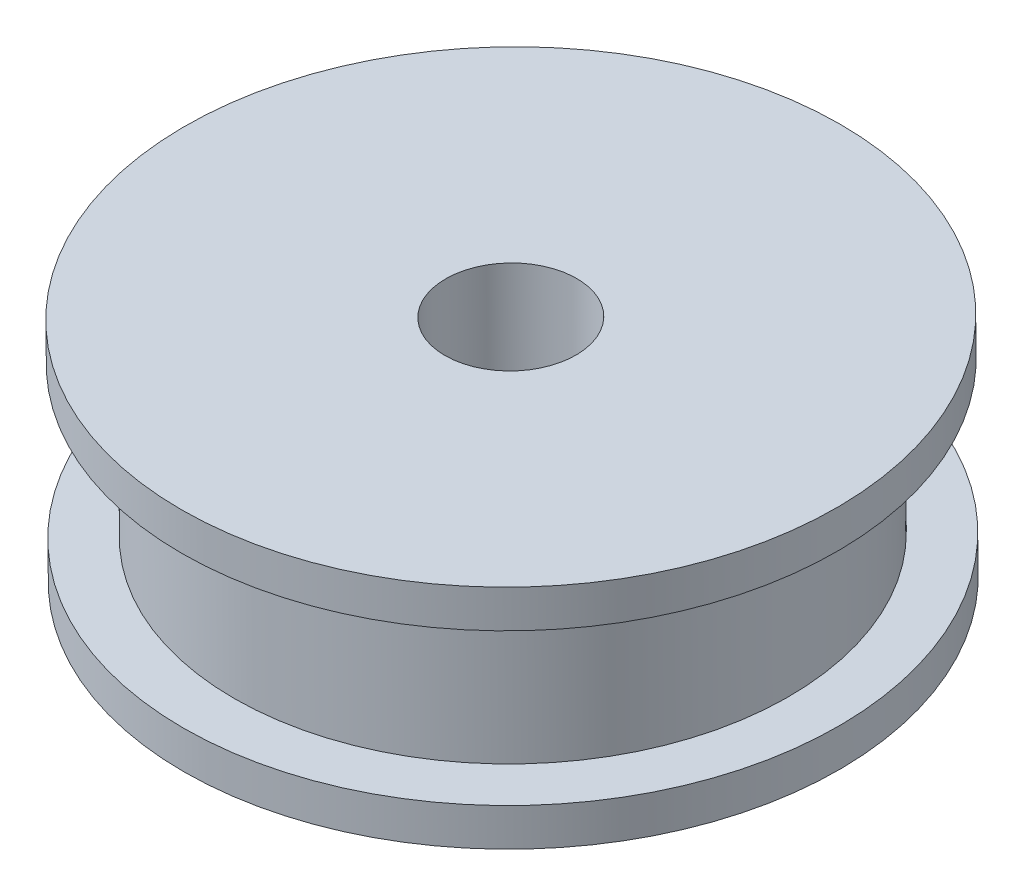
ISO-10303-21;
HEADER;
FILE_DESCRIPTION(('STEP AP214'),'2;1');
FILE_NAME('part.step','',(''),(''),'','','');
FILE_SCHEMA(('AUTOMOTIVE_DESIGN { 1 0 10303 214 1 1 1 1 }'));
ENDSEC;
DATA;
#1=APPLICATION_CONTEXT('core data for automotive mechanical design processes');
#2=APPLICATION_PROTOCOL_DEFINITION('international standard','automotive_design',2000,#1);
#3=PRODUCT_CONTEXT('',#1,'mechanical');
#4=PRODUCT('Part','Part','',(#3));
#5=PRODUCT_RELATED_PRODUCT_CATEGORY('part','',(#4));
#6=PRODUCT_DEFINITION_FORMATION('','',#4);
#7=PRODUCT_DEFINITION_CONTEXT('part definition',#1,'design');
#8=PRODUCT_DEFINITION('design','',#6,#7);
#9=PRODUCT_DEFINITION_SHAPE('','',#8);
#10=(LENGTH_UNIT() NAMED_UNIT(*) SI_UNIT(.MILLI.,.METRE.));
#11=(NAMED_UNIT(*) PLANE_ANGLE_UNIT() SI_UNIT($,.RADIAN.));
#12=(NAMED_UNIT(*) SI_UNIT($,.STERADIAN.) SOLID_ANGLE_UNIT());
#13=UNCERTAINTY_MEASURE_WITH_UNIT(LENGTH_MEASURE(1.E-05),#10,'distance_accuracy_value','');
#14=(GEOMETRIC_REPRESENTATION_CONTEXT(3) GLOBAL_UNCERTAINTY_ASSIGNED_CONTEXT((#13)) GLOBAL_UNIT_ASSIGNED_CONTEXT((#10,
#11,#12)) REPRESENTATION_CONTEXT('',''));
#15=CARTESIAN_POINT('',(0.,0.,0.));
#16=DIRECTION('',(0.,0.,1.));
#17=DIRECTION('',(1.,0.,0.));
#18=AXIS2_PLACEMENT_3D('',#15,#16,#17);
#19=CARTESIAN_POINT('',(-0.0188341703012513,8.85642782679297,-1.52504104998017));
#20=DIRECTION('',(0.00212652928721231,-0.999961923064171,-0.0084634682604122));
#21=DIRECTION('',(0.,0.00846348739691547,-0.99996418404915));
#22=AXIS2_PLACEMENT_3D('',#19,#20,#21);
#23=CYLINDRICAL_SURFACE('',#22,11.);
#24=CARTESIAN_POINT('',(-0.0188341703012513,8.85642782679297,-1.52504104998017));
#25=DIRECTION('',(-0.00212652928721231,0.999961923064171,0.00846346826041221));
#26=DIRECTION('',(0.,-0.00846348739691547,0.99996418404915));
#27=AXIS2_PLACEMENT_3D('',#24,#25,#26);
#28=CIRCLE('',#27,11.);
#29=CARTESIAN_POINT('',(-0.0188341703012513,8.7633294654269,9.47456497456048));
#30=VERTEX_POINT('',#29);
#31=EDGE_CURVE('E10',#30,#30,#28,.T.);
#32=ORIENTED_EDGE('',*,*,#31,.F.);
#33=EDGE_LOOP('',(#32));
#34=FACE_BOUND('',#33,.T.);
#35=CARTESIAN_POINT('',(-0.00607499457797741,2.85665628840794,-1.57582185954264));
#36=DIRECTION('',(-0.00212652928721231,0.999961923064171,0.00846346826041221));
#37=DIRECTION('',(0.,-0.00846348739691547,0.99996418404915));
#38=AXIS2_PLACEMENT_3D('',#35,#36,#37);
#39=CIRCLE('',#38,11.);
#40=CARTESIAN_POINT('',(-0.00607499457797741,2.76355792704187,9.42378416499801));
#41=VERTEX_POINT('',#40);
#42=EDGE_CURVE('E55',#41,#41,#39,.T.);
#43=ORIENTED_EDGE('',*,*,#42,.T.);
#44=EDGE_LOOP('',(#43));
#45=FACE_BOUND('',#44,.T.);
#46=ADVANCED_FACE('F40',(#34,#45),#23,.T.);
#47=CARTESIAN_POINT('',(-0.0188341703012513,8.85642782679297,-1.52504104998017));
#48=DIRECTION('',(-0.00212652928721231,0.999961923064171,0.00846346826041221));
#49=DIRECTION('',(0.,-0.00846348739691547,0.99996418404915));
#50=AXIS2_PLACEMENT_3D('',#47,#48,#49);
#51=PLANE('',#50);
#52=ORIENTED_EDGE('',*,*,#31,.T.);
#53=EDGE_LOOP('',(#52));
#54=FACE_BOUND('',#53,.T.);
#55=CARTESIAN_POINT('',(-0.0188341703012513,8.85642782679297,-1.52504104998017));
#56=DIRECTION('',(-0.00212652928721231,0.999961923064171,0.00846346826041221));
#57=DIRECTION('',(0.,-0.00846348739691547,0.99996418404915));
#58=AXIS2_PLACEMENT_3D('',#55,#56,#57);
#59=CIRCLE('',#58,13.);
#60=CARTESIAN_POINT('',(-0.0188341703012513,8.74640249063307,11.4744933426588));
#61=VERTEX_POINT('',#60);
#62=EDGE_CURVE('E47',#61,#61,#59,.T.);
#63=ORIENTED_EDGE('',*,*,#62,.F.);
#64=EDGE_LOOP('',(#63));
#65=FACE_BOUND('',#64,.T.);
#66=ADVANCED_FACE('F91',(#54,#65),#51,.F.);
#67=CARTESIAN_POINT('',(-0.0220239642320697,10.3563707113892,-1.51234584758955));
#68=DIRECTION('',(-0.00212652928721231,0.999961923064171,0.00846346826041221));
#69=DIRECTION('',(0.,-0.00846348739691547,0.99996418404915));
#70=AXIS2_PLACEMENT_3D('',#67,#68,#69);
#71=PLANE('',#70);
#72=CARTESIAN_POINT('',(-0.0220239642320697,10.3563707113892,-1.51234584758955));
#73=DIRECTION('',(-0.00212652928721231,0.999961923064171,0.00846346826041221));
#74=DIRECTION('',(0.,-0.00846348739691547,0.99996418404915));
#75=AXIS2_PLACEMENT_3D('',#72,#73,#74);
#76=CIRCLE('',#75,2.6);
#77=CARTESIAN_POINT('',(-0.0220239642320697,10.3343656441573,1.08756103093824));
#78=VERTEX_POINT('',#77);
#79=EDGE_CURVE('E69',#78,#78,#76,.T.);
#80=ORIENTED_EDGE('',*,*,#79,.F.);
#81=EDGE_LOOP('',(#80));
#82=FACE_BOUND('',#81,.T.);
#83=CARTESIAN_POINT('',(-0.0220239642320697,10.3563707113892,-1.51234584758955));
#84=DIRECTION('',(-0.00212652928721231,0.999961923064171,0.00846346826041221));
#85=DIRECTION('',(0.,-0.00846348739691547,0.99996418404915));
#86=AXIS2_PLACEMENT_3D('',#83,#84,#85);
#87=CIRCLE('',#86,13.);
#88=CARTESIAN_POINT('',(-0.0220239642320697,10.2463453752293,11.4871885450494));
#89=VERTEX_POINT('',#88);
#90=EDGE_CURVE('E42',#89,#89,#87,.T.);
#91=ORIENTED_EDGE('',*,*,#90,.T.);
#92=EDGE_LOOP('',(#91));
#93=FACE_BOUND('',#92,.T.);
#94=ADVANCED_FACE('F98',(#82,#93),#71,.T.);
#95=CARTESIAN_POINT('',(-0.0220239642320697,10.3563707113892,-1.51234584758955));
#96=DIRECTION('',(0.00212652928721231,-0.999961923064171,-0.00846346826041221));
#97=DIRECTION('',(0.,0.00846348739691547,-0.99996418404915));
#98=AXIS2_PLACEMENT_3D('',#95,#96,#97);
#99=CYLINDRICAL_SURFACE('',#98,13.);
#100=ORIENTED_EDGE('',*,*,#90,.F.);
#101=EDGE_LOOP('',(#100));
#102=FACE_BOUND('',#101,.T.);
#103=ORIENTED_EDGE('',*,*,#62,.T.);
#104=EDGE_LOOP('',(#103));
#105=FACE_BOUND('',#104,.T.);
#106=ADVANCED_FACE('F86',(#102,#105),#99,.T.);
#107=CARTESIAN_POINT('',(-0.00607499457797744,2.85665628840795,-1.57582185954264));
#108=DIRECTION('',(0.00212652928721231,-0.999961923064171,-0.00846346826041221));
#109=DIRECTION('',(0.,-0.00846348739691548,0.99996418404915));
#110=AXIS2_PLACEMENT_3D('',#107,#108,#109);
#111=PLANE('',#110);
#112=ORIENTED_EDGE('',*,*,#42,.F.);
#113=EDGE_LOOP('',(#112));
#114=FACE_BOUND('',#113,.T.);
#115=CARTESIAN_POINT('',(-0.00607499457797744,2.85665628840795,-1.57582185954264));
#116=DIRECTION('',(-0.00212652928721231,0.999961923064171,0.00846346826041221));
#117=DIRECTION('',(0.,-0.00846348739691548,0.99996418404915));
#118=AXIS2_PLACEMENT_3D('',#115,#116,#117);
#119=CIRCLE('',#118,13.);
#120=CARTESIAN_POINT('',(-0.00607499457797744,2.74663095224805,11.4237125330963));
#121=VERTEX_POINT('',#120);
#122=EDGE_CURVE('E56',#121,#121,#119,.T.);
#123=ORIENTED_EDGE('',*,*,#122,.T.);
#124=EDGE_LOOP('',(#123));
#125=FACE_BOUND('',#124,.T.);
#126=ADVANCED_FACE('F78',(#114,#125),#111,.F.);
#127=CARTESIAN_POINT('',(-0.00288520064715897,1.3567134038117,-1.58851706193326));
#128=DIRECTION('',(0.00212652928721231,-0.999961923064171,-0.00846346826041221));
#129=DIRECTION('',(0.,-0.00846348739691548,0.99996418404915));
#130=AXIS2_PLACEMENT_3D('',#127,#128,#129);
#131=PLANE('',#130);
#132=CARTESIAN_POINT('',(-0.00288520064715896,1.3567134038117,-1.58851706193326));
#133=DIRECTION('',(0.00212652928721231,-0.999961923064171,-0.00846346826041221));
#134=DIRECTION('',(0.,0.00846348739691547,-0.99996418404915));
#135=AXIS2_PLACEMENT_3D('',#132,#133,#134);
#136=CIRCLE('',#135,2.6);
#137=CARTESIAN_POINT('',(-0.00288520064715896,1.37871847104368,-4.18842394046105));
#138=VERTEX_POINT('',#137);
#139=EDGE_CURVE('E37',#138,#138,#136,.T.);
#140=ORIENTED_EDGE('',*,*,#139,.F.);
#141=EDGE_LOOP('',(#140));
#142=FACE_BOUND('',#141,.T.);
#143=CARTESIAN_POINT('',(-0.00288520064715897,1.3567134038117,-1.58851706193326));
#144=DIRECTION('',(-0.00212652928721231,0.999961923064171,0.00846346826041221));
#145=DIRECTION('',(0.,-0.00846348739691548,0.99996418404915));
#146=AXIS2_PLACEMENT_3D('',#143,#144,#145);
#147=CIRCLE('',#146,13.);
#148=CARTESIAN_POINT('',(-0.00288520064715897,1.24668806765179,11.4110173307057));
#149=VERTEX_POINT('',#148);
#150=EDGE_CURVE('E53',#149,#149,#147,.T.);
#151=ORIENTED_EDGE('',*,*,#150,.F.);
#152=EDGE_LOOP('',(#151));
#153=FACE_BOUND('',#152,.T.);
#154=ADVANCED_FACE('F73',(#142,#153),#131,.T.);
#155=CARTESIAN_POINT('',(-0.00288520064715897,1.3567134038117,-1.58851706193326));
#156=DIRECTION('',(-0.00212652928721231,0.999961923064171,0.0084634682604122));
#157=DIRECTION('',(0.,-0.00846348739691547,0.99996418404915));
#158=AXIS2_PLACEMENT_3D('',#155,#156,#157);
#159=CYLINDRICAL_SURFACE('',#158,13.);
#160=ORIENTED_EDGE('',*,*,#150,.T.);
#161=EDGE_LOOP('',(#160));
#162=FACE_BOUND('',#161,.T.);
#163=ORIENTED_EDGE('',*,*,#122,.F.);
#164=EDGE_LOOP('',(#163));
#165=FACE_BOUND('',#164,.T.);
#166=ADVANCED_FACE('F79',(#162,#165),#159,.T.);
#167=CARTESIAN_POINT('',(-0.0023512150935453,1.10561635836259,-1.59064229473005));
#168=DIRECTION('',(-0.00212652928721231,0.999961923064171,0.00846346826041221));
#169=DIRECTION('',(0.,-0.00846348739691547,0.99996418404915));
#170=AXIS2_PLACEMENT_3D('',#167,#168,#169);
#171=CYLINDRICAL_SURFACE('',#170,2.6);
#172=ORIENTED_EDGE('',*,*,#139,.T.);
#173=EDGE_LOOP('',(#172));
#174=FACE_BOUND('',#173,.T.);
#175=ORIENTED_EDGE('',*,*,#79,.T.);
#176=EDGE_LOOP('',(#175));
#177=FACE_BOUND('',#176,.T.);
#178=ADVANCED_FACE('F71',(#174,#177),#171,.F.);
#179=CLOSED_SHELL('',(#46,#66,#94,#106,#126,#154,#166,#178));
#180=MANIFOLD_SOLID_BREP('B2',#179);
#181=ADVANCED_BREP_SHAPE_REPRESENTATION('',(#18,#180),#14);
#182=SHAPE_DEFINITION_REPRESENTATION(#9,#181);
ENDSEC;
END-ISO-10303-21;
